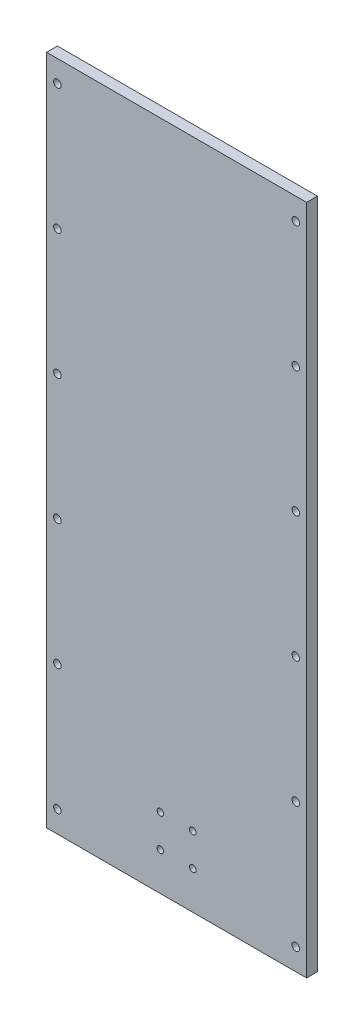
ISO-10303-21;
HEADER;
FILE_DESCRIPTION(('STEP AP214'),'2;1');
FILE_NAME('part.step','',(''),(''),'','','');
FILE_SCHEMA(('AUTOMOTIVE_DESIGN { 1 0 10303 214 1 1 1 1 }'));
ENDSEC;
DATA;
#1=APPLICATION_CONTEXT('core data for automotive mechanical design processes');
#2=APPLICATION_PROTOCOL_DEFINITION('international standard','automotive_design',2000,#1);
#3=PRODUCT_CONTEXT('',#1,'mechanical');
#4=PRODUCT('Part','Part','',(#3));
#5=PRODUCT_RELATED_PRODUCT_CATEGORY('part','',(#4));
#6=PRODUCT_DEFINITION_FORMATION('','',#4);
#7=PRODUCT_DEFINITION_CONTEXT('part definition',#1,'design');
#8=PRODUCT_DEFINITION('design','',#6,#7);
#9=PRODUCT_DEFINITION_SHAPE('','',#8);
#10=(LENGTH_UNIT() NAMED_UNIT(*) SI_UNIT(.MILLI.,.METRE.));
#11=(NAMED_UNIT(*) PLANE_ANGLE_UNIT() SI_UNIT($,.RADIAN.));
#12=(NAMED_UNIT(*) SI_UNIT($,.STERADIAN.) SOLID_ANGLE_UNIT());
#13=UNCERTAINTY_MEASURE_WITH_UNIT(LENGTH_MEASURE(1.E-05),#10,'distance_accuracy_value','');
#14=(GEOMETRIC_REPRESENTATION_CONTEXT(3) GLOBAL_UNCERTAINTY_ASSIGNED_CONTEXT((#13)) GLOBAL_UNIT_ASSIGNED_CONTEXT((#10,
#11,#12)) REPRESENTATION_CONTEXT('',''));
#15=CARTESIAN_POINT('',(0.,0.,0.));
#16=DIRECTION('',(0.,0.,1.));
#17=DIRECTION('',(1.,0.,0.));
#18=AXIS2_PLACEMENT_3D('',#15,#16,#17);
#19=CARTESIAN_POINT('',(-60.,-155.,5.));
#20=DIRECTION('',(1.,0.,0.));
#21=DIRECTION('',(0.,0.,-1.));
#22=AXIS2_PLACEMENT_3D('',#19,#20,#21);
#23=PLANE('',#22);
#24=DIRECTION('',(0.,-1.,0.));
#25=VECTOR('',#24,1.);
#26=CARTESIAN_POINT('',(-60.,-155.,0.));
#27=LINE('',#26,#25);
#28=CARTESIAN_POINT('',(-60.,155.,0.));
#29=VERTEX_POINT('',#28);
#30=CARTESIAN_POINT('',(-60.,-155.,0.));
#31=VERTEX_POINT('',#30);
#32=EDGE_CURVE('E101',#29,#31,#27,.T.);
#33=ORIENTED_EDGE('',*,*,#32,.T.);
#34=DIRECTION('',(0.,0.,-1.));
#35=VECTOR('',#34,1.);
#36=CARTESIAN_POINT('',(-60.,-155.,5.));
#37=LINE('',#36,#35);
#38=CARTESIAN_POINT('',(-60.,-155.,5.));
#39=VERTEX_POINT('',#38);
#40=EDGE_CURVE('E11',#39,#31,#37,.T.);
#41=ORIENTED_EDGE('',*,*,#40,.F.);
#42=DIRECTION('',(0.,-1.,0.));
#43=VECTOR('',#42,1.);
#44=CARTESIAN_POINT('',(-60.,-155.,5.));
#45=LINE('',#44,#43);
#46=CARTESIAN_POINT('',(-60.,155.,5.));
#47=VERTEX_POINT('',#46);
#48=EDGE_CURVE('E88',#47,#39,#45,.T.);
#49=ORIENTED_EDGE('',*,*,#48,.F.);
#50=DIRECTION('',(0.,0.,-1.));
#51=VECTOR('',#50,1.);
#52=CARTESIAN_POINT('',(-60.,155.,5.));
#53=LINE('',#52,#51);
#54=EDGE_CURVE('E97',#47,#29,#53,.T.);
#55=ORIENTED_EDGE('',*,*,#54,.T.);
#56=EDGE_LOOP('',(#33,#41,#49,#55));
#57=FACE_BOUND('',#56,.T.);
#58=ADVANCED_FACE('F35',(#57),#23,.F.);
#59=CARTESIAN_POINT('',(60.,-155.,5.));
#60=DIRECTION('',(0.,1.,0.));
#61=DIRECTION('',(0.,0.,1.));
#62=AXIS2_PLACEMENT_3D('',#59,#60,#61);
#63=PLANE('',#62);
#64=DIRECTION('',(1.,0.,0.));
#65=VECTOR('',#64,1.);
#66=CARTESIAN_POINT('',(60.,-155.,0.));
#67=LINE('',#66,#65);
#68=CARTESIAN_POINT('',(60.,-155.,0.));
#69=VERTEX_POINT('',#68);
#70=EDGE_CURVE('E92',#31,#69,#67,.T.);
#71=ORIENTED_EDGE('',*,*,#70,.T.);
#72=DIRECTION('',(0.,0.,-1.));
#73=VECTOR('',#72,1.);
#74=CARTESIAN_POINT('',(60.,-155.,5.));
#75=LINE('',#74,#73);
#76=CARTESIAN_POINT('',(60.,-155.,5.));
#77=VERTEX_POINT('',#76);
#78=EDGE_CURVE('E44',#77,#69,#75,.T.);
#79=ORIENTED_EDGE('',*,*,#78,.F.);
#80=DIRECTION('',(1.,0.,0.));
#81=VECTOR('',#80,1.);
#82=CARTESIAN_POINT('',(60.,-155.,5.));
#83=LINE('',#82,#81);
#84=EDGE_CURVE('E83',#39,#77,#83,.T.);
#85=ORIENTED_EDGE('',*,*,#84,.F.);
#86=ORIENTED_EDGE('',*,*,#40,.T.);
#87=EDGE_LOOP('',(#71,#79,#85,#86));
#88=FACE_BOUND('',#87,.T.);
#89=ADVANCED_FACE('F91',(#88),#63,.F.);
#90=CARTESIAN_POINT('',(60.,-155.,5.));
#91=DIRECTION('',(-1.,0.,0.));
#92=DIRECTION('',(0.,0.,1.));
#93=AXIS2_PLACEMENT_3D('',#90,#91,#92);
#94=PLANE('',#93);
#95=DIRECTION('',(0.,1.,0.));
#96=VECTOR('',#95,1.);
#97=CARTESIAN_POINT('',(60.,-155.,0.));
#98=LINE('',#97,#96);
#99=CARTESIAN_POINT('',(60.,155.,0.));
#100=VERTEX_POINT('',#99);
#101=EDGE_CURVE('E70',#69,#100,#98,.T.);
#102=ORIENTED_EDGE('',*,*,#101,.T.);
#103=DIRECTION('',(0.,0.,-1.));
#104=VECTOR('',#103,1.);
#105=CARTESIAN_POINT('',(60.,155.,5.));
#106=LINE('',#105,#104);
#107=CARTESIAN_POINT('',(60.,155.,5.));
#108=VERTEX_POINT('',#107);
#109=EDGE_CURVE('E93',#108,#100,#106,.T.);
#110=ORIENTED_EDGE('',*,*,#109,.F.);
#111=DIRECTION('',(0.,1.,0.));
#112=VECTOR('',#111,1.);
#113=CARTESIAN_POINT('',(60.,-155.,5.));
#114=LINE('',#113,#112);
#115=EDGE_CURVE('E86',#77,#108,#114,.T.);
#116=ORIENTED_EDGE('',*,*,#115,.F.);
#117=ORIENTED_EDGE('',*,*,#78,.T.);
#118=EDGE_LOOP('',(#102,#110,#116,#117));
#119=FACE_BOUND('',#118,.T.);
#120=ADVANCED_FACE('F95',(#119),#94,.F.);
#121=CARTESIAN_POINT('',(60.,155.,5.));
#122=DIRECTION('',(0.,-1.,0.));
#123=DIRECTION('',(0.,0.,-1.));
#124=AXIS2_PLACEMENT_3D('',#121,#122,#123);
#125=PLANE('',#124);
#126=DIRECTION('',(-1.,0.,0.));
#127=VECTOR('',#126,1.);
#128=CARTESIAN_POINT('',(60.,155.,0.));
#129=LINE('',#128,#127);
#130=EDGE_CURVE('E76',#100,#29,#129,.T.);
#131=ORIENTED_EDGE('',*,*,#130,.T.);
#132=ORIENTED_EDGE('',*,*,#54,.F.);
#133=DIRECTION('',(-1.,0.,0.));
#134=VECTOR('',#133,1.);
#135=CARTESIAN_POINT('',(60.,155.,5.));
#136=LINE('',#135,#134);
#137=EDGE_CURVE('E53',#108,#47,#136,.T.);
#138=ORIENTED_EDGE('',*,*,#137,.F.);
#139=ORIENTED_EDGE('',*,*,#109,.T.);
#140=EDGE_LOOP('',(#131,#132,#138,#139));
#141=FACE_BOUND('',#140,.T.);
#142=ADVANCED_FACE('F190',(#141),#125,.F.);
#143=CARTESIAN_POINT('',(0.,0.,5.));
#144=DIRECTION('',(0.,0.,1.));
#145=DIRECTION('',(1.,0.,0.));
#146=AXIS2_PLACEMENT_3D('',#143,#144,#145);
#147=PLANE('',#146);
#148=CARTESIAN_POINT('',(55.,87.,5.));
#149=DIRECTION('',(0.,0.,1.));
#150=DIRECTION('',(-1.,0.,0.));
#151=AXIS2_PLACEMENT_3D('',#148,#149,#150);
#152=CIRCLE('',#151,1.74759299465095);
#153=CARTESIAN_POINT('',(53.252407005349,87.,5.));
#154=VERTEX_POINT('',#153);
#155=EDGE_CURVE('E415',#154,#154,#152,.T.);
#156=ORIENTED_EDGE('',*,*,#155,.F.);
#157=EDGE_LOOP('',(#156));
#158=FACE_BOUND('',#157,.T.);
#159=CARTESIAN_POINT('',(55.,-145.,5.));
#160=DIRECTION('',(0.,0.,1.));
#161=DIRECTION('',(-1.,0.,0.));
#162=AXIS2_PLACEMENT_3D('',#159,#160,#161);
#163=CIRCLE('',#162,1.74759299465095);
#164=CARTESIAN_POINT('',(53.252407005349,-145.,5.));
#165=VERTEX_POINT('',#164);
#166=EDGE_CURVE('E409',#165,#165,#163,.T.);
#167=ORIENTED_EDGE('',*,*,#166,.F.);
#168=EDGE_LOOP('',(#167));
#169=FACE_BOUND('',#168,.T.);
#170=CARTESIAN_POINT('',(-55.,-87.,5.));
#171=DIRECTION('',(0.,0.,1.));
#172=DIRECTION('',(1.,0.,0.));
#173=AXIS2_PLACEMENT_3D('',#170,#171,#172);
#174=CIRCLE('',#173,1.74759299465095);
#175=CARTESIAN_POINT('',(-53.252407005349,-87.,5.));
#176=VERTEX_POINT('',#175);
#177=EDGE_CURVE('E365',#176,#176,#174,.T.);
#178=ORIENTED_EDGE('',*,*,#177,.F.);
#179=EDGE_LOOP('',(#178));
#180=FACE_BOUND('',#179,.T.);
#181=CARTESIAN_POINT('',(-55.,-29.,5.));
#182=DIRECTION('',(0.,0.,1.));
#183=DIRECTION('',(1.,0.,0.));
#184=AXIS2_PLACEMENT_3D('',#181,#182,#183);
#185=CIRCLE('',#184,1.74759299465095);
#186=CARTESIAN_POINT('',(-53.252407005349,-29.,5.));
#187=VERTEX_POINT('',#186);
#188=EDGE_CURVE('E408',#187,#187,#185,.T.);
#189=ORIENTED_EDGE('',*,*,#188,.F.);
#190=EDGE_LOOP('',(#189));
#191=FACE_BOUND('',#190,.T.);
#192=CARTESIAN_POINT('',(-55.,-145.,5.));
#193=DIRECTION('',(0.,0.,1.));
#194=DIRECTION('',(1.,0.,0.));
#195=AXIS2_PLACEMENT_3D('',#192,#193,#194);
#196=CIRCLE('',#195,1.74759299465095);
#197=CARTESIAN_POINT('',(-53.252407005349,-145.,5.));
#198=VERTEX_POINT('',#197);
#199=EDGE_CURVE('E427',#198,#198,#196,.T.);
#200=ORIENTED_EDGE('',*,*,#199,.F.);
#201=EDGE_LOOP('',(#200));
#202=FACE_BOUND('',#201,.T.);
#203=CARTESIAN_POINT('',(55.,145.,5.));
#204=DIRECTION('',(0.,0.,1.));
#205=DIRECTION('',(1.,0.,0.));
#206=AXIS2_PLACEMENT_3D('',#203,#204,#205);
#207=CIRCLE('',#206,1.74759299465095);
#208=CARTESIAN_POINT('',(56.747592994651,145.,5.));
#209=VERTEX_POINT('',#208);
#210=EDGE_CURVE('E424',#209,#209,#207,.T.);
#211=ORIENTED_EDGE('',*,*,#210,.F.);
#212=EDGE_LOOP('',(#211));
#213=FACE_BOUND('',#212,.T.);
#214=CARTESIAN_POINT('',(-55.,87.,5.));
#215=DIRECTION('',(0.,0.,1.));
#216=DIRECTION('',(1.,0.,0.));
#217=AXIS2_PLACEMENT_3D('',#214,#215,#216);
#218=CIRCLE('',#217,1.74759299465095);
#219=CARTESIAN_POINT('',(-53.252407005349,87.,5.));
#220=VERTEX_POINT('',#219);
#221=EDGE_CURVE('E421',#220,#220,#218,.T.);
#222=ORIENTED_EDGE('',*,*,#221,.F.);
#223=EDGE_LOOP('',(#222));
#224=FACE_BOUND('',#223,.T.);
#225=CARTESIAN_POINT('',(-55.,29.,5.));
#226=DIRECTION('',(0.,0.,1.));
#227=DIRECTION('',(1.,0.,0.));
#228=AXIS2_PLACEMENT_3D('',#225,#226,#227);
#229=CIRCLE('',#228,1.74759299465095);
#230=CARTESIAN_POINT('',(-53.252407005349,29.,5.));
#231=VERTEX_POINT('',#230);
#232=EDGE_CURVE('E412',#231,#231,#229,.T.);
#233=ORIENTED_EDGE('',*,*,#232,.F.);
#234=EDGE_LOOP('',(#233));
#235=FACE_BOUND('',#234,.T.);
#236=CARTESIAN_POINT('',(-7.5,-137.5,5.));
#237=DIRECTION('',(0.,0.,1.));
#238=DIRECTION('',(1.,0.,0.));
#239=AXIS2_PLACEMENT_3D('',#236,#237,#238);
#240=CIRCLE('',#239,1.5);
#241=CARTESIAN_POINT('',(-6.,-137.5,5.));
#242=VERTEX_POINT('',#241);
#243=EDGE_CURVE('E445',#242,#242,#240,.T.);
#244=ORIENTED_EDGE('',*,*,#243,.F.);
#245=EDGE_LOOP('',(#244));
#246=FACE_BOUND('',#245,.T.);
#247=CARTESIAN_POINT('',(7.5,-137.5,5.));
#248=DIRECTION('',(0.,0.,1.));
#249=DIRECTION('',(1.,0.,0.));
#250=AXIS2_PLACEMENT_3D('',#247,#248,#249);
#251=CIRCLE('',#250,1.5);
#252=CARTESIAN_POINT('',(9.,-137.5,5.));
#253=VERTEX_POINT('',#252);
#254=EDGE_CURVE('E449',#253,#253,#251,.T.);
#255=ORIENTED_EDGE('',*,*,#254,.F.);
#256=EDGE_LOOP('',(#255));
#257=FACE_BOUND('',#256,.T.);
#258=CARTESIAN_POINT('',(7.5,-122.5,5.));
#259=DIRECTION('',(0.,0.,1.));
#260=DIRECTION('',(1.,0.,0.));
#261=AXIS2_PLACEMENT_3D('',#258,#259,#260);
#262=CIRCLE('',#261,1.5);
#263=CARTESIAN_POINT('',(9.,-122.5,5.));
#264=VERTEX_POINT('',#263);
#265=EDGE_CURVE('E453',#264,#264,#262,.T.);
#266=ORIENTED_EDGE('',*,*,#265,.F.);
#267=EDGE_LOOP('',(#266));
#268=FACE_BOUND('',#267,.T.);
#269=CARTESIAN_POINT('',(-7.5,-122.5,5.));
#270=DIRECTION('',(0.,0.,1.));
#271=DIRECTION('',(1.,0.,0.));
#272=AXIS2_PLACEMENT_3D('',#269,#270,#271);
#273=CIRCLE('',#272,1.5);
#274=CARTESIAN_POINT('',(-6.,-122.5,5.));
#275=VERTEX_POINT('',#274);
#276=EDGE_CURVE('E457',#275,#275,#273,.T.);
#277=ORIENTED_EDGE('',*,*,#276,.F.);
#278=EDGE_LOOP('',(#277));
#279=FACE_BOUND('',#278,.T.);
#280=CARTESIAN_POINT('',(55.,-87.,5.));
#281=DIRECTION('',(0.,0.,1.));
#282=DIRECTION('',(-1.,0.,0.));
#283=AXIS2_PLACEMENT_3D('',#280,#281,#282);
#284=CIRCLE('',#283,1.74759299465095);
#285=CARTESIAN_POINT('',(53.252407005349,-87.,5.));
#286=VERTEX_POINT('',#285);
#287=EDGE_CURVE('E461',#286,#286,#284,.T.);
#288=ORIENTED_EDGE('',*,*,#287,.F.);
#289=EDGE_LOOP('',(#288));
#290=FACE_BOUND('',#289,.T.);
#291=CARTESIAN_POINT('',(55.,-29.,5.));
#292=DIRECTION('',(0.,0.,1.));
#293=DIRECTION('',(-1.,0.,0.));
#294=AXIS2_PLACEMENT_3D('',#291,#292,#293);
#295=CIRCLE('',#294,1.74759299465095);
#296=CARTESIAN_POINT('',(53.252407005349,-29.,5.));
#297=VERTEX_POINT('',#296);
#298=EDGE_CURVE('E465',#297,#297,#295,.T.);
#299=ORIENTED_EDGE('',*,*,#298,.F.);
#300=EDGE_LOOP('',(#299));
#301=FACE_BOUND('',#300,.T.);
#302=CARTESIAN_POINT('',(55.,29.,5.));
#303=DIRECTION('',(0.,0.,1.));
#304=DIRECTION('',(-1.,0.,0.));
#305=AXIS2_PLACEMENT_3D('',#302,#303,#304);
#306=CIRCLE('',#305,1.74759299465095);
#307=CARTESIAN_POINT('',(53.252407005349,29.,5.));
#308=VERTEX_POINT('',#307);
#309=EDGE_CURVE('E420',#308,#308,#306,.T.);
#310=ORIENTED_EDGE('',*,*,#309,.F.);
#311=EDGE_LOOP('',(#310));
#312=FACE_BOUND('',#311,.T.);
#313=CARTESIAN_POINT('',(-55.,145.,5.));
#314=DIRECTION('',(0.,0.,1.));
#315=DIRECTION('',(1.,0.,0.));
#316=AXIS2_PLACEMENT_3D('',#313,#314,#315);
#317=CIRCLE('',#316,1.74759299465095);
#318=CARTESIAN_POINT('',(-53.252407005349,145.,5.));
#319=VERTEX_POINT('',#318);
#320=EDGE_CURVE('E113',#319,#319,#317,.T.);
#321=ORIENTED_EDGE('',*,*,#320,.F.);
#322=EDGE_LOOP('',(#321));
#323=FACE_BOUND('',#322,.T.);
#324=ORIENTED_EDGE('',*,*,#48,.T.);
#325=ORIENTED_EDGE('',*,*,#84,.T.);
#326=ORIENTED_EDGE('',*,*,#115,.T.);
#327=ORIENTED_EDGE('',*,*,#137,.T.);
#328=EDGE_LOOP('',(#324,#325,#326,#327));
#329=FACE_BOUND('',#328,.T.);
#330=ADVANCED_FACE('F84',(#158,#169,#180,#191,#202,#213,#224,#235,#246,#257,#268,#279,#290,#301,
#312,#323,#329),#147,.T.);
#331=CARTESIAN_POINT('',(0.,0.,0.));
#332=DIRECTION('',(0.,0.,1.));
#333=DIRECTION('',(1.,0.,0.));
#334=AXIS2_PLACEMENT_3D('',#331,#332,#333);
#335=PLANE('',#334);
#336=CARTESIAN_POINT('',(55.,87.,0.));
#337=DIRECTION('',(0.,0.,1.));
#338=DIRECTION('',(1.,0.,0.));
#339=AXIS2_PLACEMENT_3D('',#336,#337,#338);
#340=CIRCLE('',#339,1.74759299465095);
#341=CARTESIAN_POINT('',(56.7475929946509,87.,0.));
#342=VERTEX_POINT('',#341);
#343=EDGE_CURVE('E38',#342,#342,#340,.T.);
#344=ORIENTED_EDGE('',*,*,#343,.T.);
#345=EDGE_LOOP('',(#344));
#346=FACE_BOUND('',#345,.T.);
#347=CARTESIAN_POINT('',(55.,-145.,0.));
#348=DIRECTION('',(0.,0.,1.));
#349=DIRECTION('',(1.,0.,0.));
#350=AXIS2_PLACEMENT_3D('',#347,#348,#349);
#351=CIRCLE('',#350,1.74759299465095);
#352=CARTESIAN_POINT('',(56.747592994651,-145.,0.));
#353=VERTEX_POINT('',#352);
#354=EDGE_CURVE('E151',#353,#353,#351,.T.);
#355=ORIENTED_EDGE('',*,*,#354,.T.);
#356=EDGE_LOOP('',(#355));
#357=FACE_BOUND('',#356,.T.);
#358=CARTESIAN_POINT('',(-55.,-87.,0.));
#359=DIRECTION('',(0.,0.,1.));
#360=DIRECTION('',(1.,0.,0.));
#361=AXIS2_PLACEMENT_3D('',#358,#359,#360);
#362=CIRCLE('',#361,1.74759299465095);
#363=CARTESIAN_POINT('',(-53.252407005349,-87.,0.));
#364=VERTEX_POINT('',#363);
#365=EDGE_CURVE('E149',#364,#364,#362,.T.);
#366=ORIENTED_EDGE('',*,*,#365,.T.);
#367=EDGE_LOOP('',(#366));
#368=FACE_BOUND('',#367,.T.);
#369=CARTESIAN_POINT('',(-55.,-29.,0.));
#370=DIRECTION('',(0.,0.,1.));
#371=DIRECTION('',(1.,0.,0.));
#372=AXIS2_PLACEMENT_3D('',#369,#370,#371);
#373=CIRCLE('',#372,1.74759299465095);
#374=CARTESIAN_POINT('',(-53.252407005349,-29.,0.));
#375=VERTEX_POINT('',#374);
#376=EDGE_CURVE('E146',#375,#375,#373,.T.);
#377=ORIENTED_EDGE('',*,*,#376,.T.);
#378=EDGE_LOOP('',(#377));
#379=FACE_BOUND('',#378,.T.);
#380=CARTESIAN_POINT('',(-55.,-145.,0.));
#381=DIRECTION('',(0.,0.,1.));
#382=DIRECTION('',(1.,0.,0.));
#383=AXIS2_PLACEMENT_3D('',#380,#381,#382);
#384=CIRCLE('',#383,1.74759299465095);
#385=CARTESIAN_POINT('',(-53.252407005349,-145.,0.));
#386=VERTEX_POINT('',#385);
#387=EDGE_CURVE('E143',#386,#386,#384,.T.);
#388=ORIENTED_EDGE('',*,*,#387,.T.);
#389=EDGE_LOOP('',(#388));
#390=FACE_BOUND('',#389,.T.);
#391=CARTESIAN_POINT('',(55.,145.,0.));
#392=DIRECTION('',(0.,0.,1.));
#393=DIRECTION('',(1.,0.,0.));
#394=AXIS2_PLACEMENT_3D('',#391,#392,#393);
#395=CIRCLE('',#394,1.74759299465095);
#396=CARTESIAN_POINT('',(56.747592994651,145.,0.));
#397=VERTEX_POINT('',#396);
#398=EDGE_CURVE('E140',#397,#397,#395,.T.);
#399=ORIENTED_EDGE('',*,*,#398,.T.);
#400=EDGE_LOOP('',(#399));
#401=FACE_BOUND('',#400,.T.);
#402=CARTESIAN_POINT('',(-55.,87.,0.));
#403=DIRECTION('',(0.,0.,1.));
#404=DIRECTION('',(1.,0.,0.));
#405=AXIS2_PLACEMENT_3D('',#402,#403,#404);
#406=CIRCLE('',#405,1.74759299465095);
#407=CARTESIAN_POINT('',(-53.252407005349,87.,0.));
#408=VERTEX_POINT('',#407);
#409=EDGE_CURVE('E137',#408,#408,#406,.T.);
#410=ORIENTED_EDGE('',*,*,#409,.T.);
#411=EDGE_LOOP('',(#410));
#412=FACE_BOUND('',#411,.T.);
#413=CARTESIAN_POINT('',(-55.,29.,0.));
#414=DIRECTION('',(0.,0.,1.));
#415=DIRECTION('',(1.,0.,0.));
#416=AXIS2_PLACEMENT_3D('',#413,#414,#415);
#417=CIRCLE('',#416,1.74759299465095);
#418=CARTESIAN_POINT('',(-53.252407005349,29.,0.));
#419=VERTEX_POINT('',#418);
#420=EDGE_CURVE('E134',#419,#419,#417,.T.);
#421=ORIENTED_EDGE('',*,*,#420,.T.);
#422=EDGE_LOOP('',(#421));
#423=FACE_BOUND('',#422,.T.);
#424=CARTESIAN_POINT('',(-7.5,-137.5,0.));
#425=DIRECTION('',(0.,0.,1.));
#426=DIRECTION('',(1.,0.,0.));
#427=AXIS2_PLACEMENT_3D('',#424,#425,#426);
#428=CIRCLE('',#427,1.5);
#429=CARTESIAN_POINT('',(-6.,-137.5,0.));
#430=VERTEX_POINT('',#429);
#431=EDGE_CURVE('E131',#430,#430,#428,.T.);
#432=ORIENTED_EDGE('',*,*,#431,.T.);
#433=EDGE_LOOP('',(#432));
#434=FACE_BOUND('',#433,.T.);
#435=CARTESIAN_POINT('',(7.5,-137.5,0.));
#436=DIRECTION('',(0.,0.,1.));
#437=DIRECTION('',(1.,0.,0.));
#438=AXIS2_PLACEMENT_3D('',#435,#436,#437);
#439=CIRCLE('',#438,1.5);
#440=CARTESIAN_POINT('',(9.,-137.5,0.));
#441=VERTEX_POINT('',#440);
#442=EDGE_CURVE('E128',#441,#441,#439,.T.);
#443=ORIENTED_EDGE('',*,*,#442,.T.);
#444=EDGE_LOOP('',(#443));
#445=FACE_BOUND('',#444,.T.);
#446=CARTESIAN_POINT('',(7.5,-122.5,0.));
#447=DIRECTION('',(0.,0.,1.));
#448=DIRECTION('',(1.,0.,0.));
#449=AXIS2_PLACEMENT_3D('',#446,#447,#448);
#450=CIRCLE('',#449,1.5);
#451=CARTESIAN_POINT('',(9.,-122.5,0.));
#452=VERTEX_POINT('',#451);
#453=EDGE_CURVE('E125',#452,#452,#450,.T.);
#454=ORIENTED_EDGE('',*,*,#453,.T.);
#455=EDGE_LOOP('',(#454));
#456=FACE_BOUND('',#455,.T.);
#457=CARTESIAN_POINT('',(-7.5,-122.5,0.));
#458=DIRECTION('',(0.,0.,1.));
#459=DIRECTION('',(1.,0.,0.));
#460=AXIS2_PLACEMENT_3D('',#457,#458,#459);
#461=CIRCLE('',#460,1.5);
#462=CARTESIAN_POINT('',(-6.,-122.5,0.));
#463=VERTEX_POINT('',#462);
#464=EDGE_CURVE('E122',#463,#463,#461,.T.);
#465=ORIENTED_EDGE('',*,*,#464,.T.);
#466=EDGE_LOOP('',(#465));
#467=FACE_BOUND('',#466,.T.);
#468=CARTESIAN_POINT('',(55.,-87.,0.));
#469=DIRECTION('',(0.,0.,1.));
#470=DIRECTION('',(1.,0.,0.));
#471=AXIS2_PLACEMENT_3D('',#468,#469,#470);
#472=CIRCLE('',#471,1.74759299465095);
#473=CARTESIAN_POINT('',(56.7475929946509,-87.,0.));
#474=VERTEX_POINT('',#473);
#475=EDGE_CURVE('E119',#474,#474,#472,.T.);
#476=ORIENTED_EDGE('',*,*,#475,.T.);
#477=EDGE_LOOP('',(#476));
#478=FACE_BOUND('',#477,.T.);
#479=CARTESIAN_POINT('',(55.,-29.,0.));
#480=DIRECTION('',(0.,0.,1.));
#481=DIRECTION('',(1.,0.,0.));
#482=AXIS2_PLACEMENT_3D('',#479,#480,#481);
#483=CIRCLE('',#482,1.74759299465095);
#484=CARTESIAN_POINT('',(56.7475929946509,-29.,0.));
#485=VERTEX_POINT('',#484);
#486=EDGE_CURVE('E116',#485,#485,#483,.T.);
#487=ORIENTED_EDGE('',*,*,#486,.T.);
#488=EDGE_LOOP('',(#487));
#489=FACE_BOUND('',#488,.T.);
#490=CARTESIAN_POINT('',(55.,29.,0.));
#491=DIRECTION('',(0.,0.,1.));
#492=DIRECTION('',(1.,0.,0.));
#493=AXIS2_PLACEMENT_3D('',#490,#491,#492);
#494=CIRCLE('',#493,1.74759299465095);
#495=CARTESIAN_POINT('',(56.7475929946509,29.,0.));
#496=VERTEX_POINT('',#495);
#497=EDGE_CURVE('E112',#496,#496,#494,.T.);
#498=ORIENTED_EDGE('',*,*,#497,.T.);
#499=EDGE_LOOP('',(#498));
#500=FACE_BOUND('',#499,.T.);
#501=CARTESIAN_POINT('',(-55.,145.,0.));
#502=DIRECTION('',(0.,0.,1.));
#503=DIRECTION('',(1.,0.,0.));
#504=AXIS2_PLACEMENT_3D('',#501,#502,#503);
#505=CIRCLE('',#504,1.74759299465095);
#506=CARTESIAN_POINT('',(-53.252407005349,145.,0.));
#507=VERTEX_POINT('',#506);
#508=EDGE_CURVE('E109',#507,#507,#505,.T.);
#509=ORIENTED_EDGE('',*,*,#508,.T.);
#510=EDGE_LOOP('',(#509));
#511=FACE_BOUND('',#510,.T.);
#512=ORIENTED_EDGE('',*,*,#32,.F.);
#513=ORIENTED_EDGE('',*,*,#130,.F.);
#514=ORIENTED_EDGE('',*,*,#101,.F.);
#515=ORIENTED_EDGE('',*,*,#70,.F.);
#516=EDGE_LOOP('',(#512,#513,#514,#515));
#517=FACE_BOUND('',#516,.T.);
#518=ADVANCED_FACE('F158',(#346,#357,#368,#379,#390,#401,#412,#423,#434,#445,#456,#467,#478,
#489,#500,#511,#517),#335,.F.);
#519=CARTESIAN_POINT('',(-55.,145.,-5.));
#520=DIRECTION('',(0.,0.,1.));
#521=DIRECTION('',(1.,0.,0.));
#522=AXIS2_PLACEMENT_3D('',#519,#520,#521);
#523=CYLINDRICAL_SURFACE('',#522,1.74759299465095);
#524=ORIENTED_EDGE('',*,*,#320,.T.);
#525=EDGE_LOOP('',(#524));
#526=FACE_BOUND('',#525,.T.);
#527=ORIENTED_EDGE('',*,*,#508,.F.);
#528=EDGE_LOOP('',(#527));
#529=FACE_BOUND('',#528,.T.);
#530=ADVANCED_FACE('F181',(#526,#529),#523,.F.);
#531=CARTESIAN_POINT('',(55.,29.,-5.));
#532=DIRECTION('',(0.,0.,1.));
#533=DIRECTION('',(1.,0.,0.));
#534=AXIS2_PLACEMENT_3D('',#531,#532,#533);
#535=CYLINDRICAL_SURFACE('',#534,1.74759299465095);
#536=ORIENTED_EDGE('',*,*,#309,.T.);
#537=EDGE_LOOP('',(#536));
#538=FACE_BOUND('',#537,.T.);
#539=ORIENTED_EDGE('',*,*,#497,.F.);
#540=EDGE_LOOP('',(#539));
#541=FACE_BOUND('',#540,.T.);
#542=ADVANCED_FACE('F187',(#538,#541),#535,.F.);
#543=CARTESIAN_POINT('',(55.,-29.,-5.));
#544=DIRECTION('',(0.,0.,1.));
#545=DIRECTION('',(1.,0.,0.));
#546=AXIS2_PLACEMENT_3D('',#543,#544,#545);
#547=CYLINDRICAL_SURFACE('',#546,1.74759299465095);
#548=ORIENTED_EDGE('',*,*,#298,.T.);
#549=EDGE_LOOP('',(#548));
#550=FACE_BOUND('',#549,.T.);
#551=ORIENTED_EDGE('',*,*,#486,.F.);
#552=EDGE_LOOP('',(#551));
#553=FACE_BOUND('',#552,.T.);
#554=ADVANCED_FACE('F230',(#550,#553),#547,.F.);
#555=CARTESIAN_POINT('',(55.,-87.,-5.));
#556=DIRECTION('',(0.,0.,1.));
#557=DIRECTION('',(1.,0.,0.));
#558=AXIS2_PLACEMENT_3D('',#555,#556,#557);
#559=CYLINDRICAL_SURFACE('',#558,1.74759299465095);
#560=ORIENTED_EDGE('',*,*,#287,.T.);
#561=EDGE_LOOP('',(#560));
#562=FACE_BOUND('',#561,.T.);
#563=ORIENTED_EDGE('',*,*,#475,.F.);
#564=EDGE_LOOP('',(#563));
#565=FACE_BOUND('',#564,.T.);
#566=ADVANCED_FACE('F240',(#562,#565),#559,.F.);
#567=CARTESIAN_POINT('',(-7.5,-122.5,-5.));
#568=DIRECTION('',(0.,0.,1.));
#569=DIRECTION('',(1.,0.,0.));
#570=AXIS2_PLACEMENT_3D('',#567,#568,#569);
#571=CYLINDRICAL_SURFACE('',#570,1.5);
#572=ORIENTED_EDGE('',*,*,#276,.T.);
#573=EDGE_LOOP('',(#572));
#574=FACE_BOUND('',#573,.T.);
#575=ORIENTED_EDGE('',*,*,#464,.F.);
#576=EDGE_LOOP('',(#575));
#577=FACE_BOUND('',#576,.T.);
#578=ADVANCED_FACE('F250',(#574,#577),#571,.F.);
#579=CARTESIAN_POINT('',(7.5,-122.5,-5.));
#580=DIRECTION('',(0.,0.,1.));
#581=DIRECTION('',(1.,0.,0.));
#582=AXIS2_PLACEMENT_3D('',#579,#580,#581);
#583=CYLINDRICAL_SURFACE('',#582,1.5);
#584=ORIENTED_EDGE('',*,*,#265,.T.);
#585=EDGE_LOOP('',(#584));
#586=FACE_BOUND('',#585,.T.);
#587=ORIENTED_EDGE('',*,*,#453,.F.);
#588=EDGE_LOOP('',(#587));
#589=FACE_BOUND('',#588,.T.);
#590=ADVANCED_FACE('F260',(#586,#589),#583,.F.);
#591=CARTESIAN_POINT('',(7.5,-137.5,-5.));
#592=DIRECTION('',(0.,0.,1.));
#593=DIRECTION('',(1.,0.,0.));
#594=AXIS2_PLACEMENT_3D('',#591,#592,#593);
#595=CYLINDRICAL_SURFACE('',#594,1.5);
#596=ORIENTED_EDGE('',*,*,#254,.T.);
#597=EDGE_LOOP('',(#596));
#598=FACE_BOUND('',#597,.T.);
#599=ORIENTED_EDGE('',*,*,#442,.F.);
#600=EDGE_LOOP('',(#599));
#601=FACE_BOUND('',#600,.T.);
#602=ADVANCED_FACE('F270',(#598,#601),#595,.F.);
#603=CARTESIAN_POINT('',(-7.5,-137.5,-5.));
#604=DIRECTION('',(0.,0.,1.));
#605=DIRECTION('',(1.,0.,0.));
#606=AXIS2_PLACEMENT_3D('',#603,#604,#605);
#607=CYLINDRICAL_SURFACE('',#606,1.5);
#608=ORIENTED_EDGE('',*,*,#243,.T.);
#609=EDGE_LOOP('',(#608));
#610=FACE_BOUND('',#609,.T.);
#611=ORIENTED_EDGE('',*,*,#431,.F.);
#612=EDGE_LOOP('',(#611));
#613=FACE_BOUND('',#612,.T.);
#614=ADVANCED_FACE('F280',(#610,#613),#607,.F.);
#615=CARTESIAN_POINT('',(-55.,29.,-5.));
#616=DIRECTION('',(0.,0.,1.));
#617=DIRECTION('',(1.,0.,0.));
#618=AXIS2_PLACEMENT_3D('',#615,#616,#617);
#619=CYLINDRICAL_SURFACE('',#618,1.74759299465095);
#620=ORIENTED_EDGE('',*,*,#232,.T.);
#621=EDGE_LOOP('',(#620));
#622=FACE_BOUND('',#621,.T.);
#623=ORIENTED_EDGE('',*,*,#420,.F.);
#624=EDGE_LOOP('',(#623));
#625=FACE_BOUND('',#624,.T.);
#626=ADVANCED_FACE('F290',(#622,#625),#619,.F.);
#627=CARTESIAN_POINT('',(-55.,87.,-5.));
#628=DIRECTION('',(0.,0.,1.));
#629=DIRECTION('',(1.,0.,0.));
#630=AXIS2_PLACEMENT_3D('',#627,#628,#629);
#631=CYLINDRICAL_SURFACE('',#630,1.74759299465095);
#632=ORIENTED_EDGE('',*,*,#221,.T.);
#633=EDGE_LOOP('',(#632));
#634=FACE_BOUND('',#633,.T.);
#635=ORIENTED_EDGE('',*,*,#409,.F.);
#636=EDGE_LOOP('',(#635));
#637=FACE_BOUND('',#636,.T.);
#638=ADVANCED_FACE('F300',(#634,#637),#631,.F.);
#639=CARTESIAN_POINT('',(55.,145.,-5.));
#640=DIRECTION('',(0.,0.,1.));
#641=DIRECTION('',(1.,0.,0.));
#642=AXIS2_PLACEMENT_3D('',#639,#640,#641);
#643=CYLINDRICAL_SURFACE('',#642,1.74759299465095);
#644=ORIENTED_EDGE('',*,*,#210,.T.);
#645=EDGE_LOOP('',(#644));
#646=FACE_BOUND('',#645,.T.);
#647=ORIENTED_EDGE('',*,*,#398,.F.);
#648=EDGE_LOOP('',(#647));
#649=FACE_BOUND('',#648,.T.);
#650=ADVANCED_FACE('F310',(#646,#649),#643,.F.);
#651=CARTESIAN_POINT('',(-55.,-145.,-5.));
#652=DIRECTION('',(0.,0.,1.));
#653=DIRECTION('',(1.,0.,0.));
#654=AXIS2_PLACEMENT_3D('',#651,#652,#653);
#655=CYLINDRICAL_SURFACE('',#654,1.74759299465095);
#656=ORIENTED_EDGE('',*,*,#199,.T.);
#657=EDGE_LOOP('',(#656));
#658=FACE_BOUND('',#657,.T.);
#659=ORIENTED_EDGE('',*,*,#387,.F.);
#660=EDGE_LOOP('',(#659));
#661=FACE_BOUND('',#660,.T.);
#662=ADVANCED_FACE('F319',(#658,#661),#655,.F.);
#663=CARTESIAN_POINT('',(-55.,-29.,-5.));
#664=DIRECTION('',(0.,0.,1.));
#665=DIRECTION('',(1.,0.,0.));
#666=AXIS2_PLACEMENT_3D('',#663,#664,#665);
#667=CYLINDRICAL_SURFACE('',#666,1.74759299465095);
#668=ORIENTED_EDGE('',*,*,#188,.T.);
#669=EDGE_LOOP('',(#668));
#670=FACE_BOUND('',#669,.T.);
#671=ORIENTED_EDGE('',*,*,#376,.F.);
#672=EDGE_LOOP('',(#671));
#673=FACE_BOUND('',#672,.T.);
#674=ADVANCED_FACE('F329',(#670,#673),#667,.F.);
#675=CARTESIAN_POINT('',(-55.,-87.,-5.));
#676=DIRECTION('',(0.,0.,1.));
#677=DIRECTION('',(1.,0.,0.));
#678=AXIS2_PLACEMENT_3D('',#675,#676,#677);
#679=CYLINDRICAL_SURFACE('',#678,1.74759299465095);
#680=ORIENTED_EDGE('',*,*,#177,.T.);
#681=EDGE_LOOP('',(#680));
#682=FACE_BOUND('',#681,.T.);
#683=ORIENTED_EDGE('',*,*,#365,.F.);
#684=EDGE_LOOP('',(#683));
#685=FACE_BOUND('',#684,.T.);
#686=ADVANCED_FACE('F168',(#682,#685),#679,.F.);
#687=CARTESIAN_POINT('',(55.,-145.,-5.));
#688=DIRECTION('',(0.,0.,1.));
#689=DIRECTION('',(1.,0.,0.));
#690=AXIS2_PLACEMENT_3D('',#687,#688,#689);
#691=CYLINDRICAL_SURFACE('',#690,1.74759299465095);
#692=ORIENTED_EDGE('',*,*,#166,.T.);
#693=EDGE_LOOP('',(#692));
#694=FACE_BOUND('',#693,.T.);
#695=ORIENTED_EDGE('',*,*,#354,.F.);
#696=EDGE_LOOP('',(#695));
#697=FACE_BOUND('',#696,.T.);
#698=ADVANCED_FACE('F162',(#694,#697),#691,.F.);
#699=CARTESIAN_POINT('',(55.,87.,-5.));
#700=DIRECTION('',(0.,0.,1.));
#701=DIRECTION('',(1.,0.,0.));
#702=AXIS2_PLACEMENT_3D('',#699,#700,#701);
#703=CYLINDRICAL_SURFACE('',#702,1.74759299465095);
#704=ORIENTED_EDGE('',*,*,#155,.T.);
#705=EDGE_LOOP('',(#704));
#706=FACE_BOUND('',#705,.T.);
#707=ORIENTED_EDGE('',*,*,#343,.F.);
#708=EDGE_LOOP('',(#707));
#709=FACE_BOUND('',#708,.T.);
#710=ADVANCED_FACE('F160',(#706,#709),#703,.F.);
#711=CLOSED_SHELL('',(#58,#89,#120,#142,#330,#518,#530,#542,#554,#566,#578,#590,#602,#614,#626,
#638,#650,#662,#674,#686,#698,#710));
#712=MANIFOLD_SOLID_BREP('B2',#711);
#713=ADVANCED_BREP_SHAPE_REPRESENTATION('',(#18,#712),#14);
#714=SHAPE_DEFINITION_REPRESENTATION(#9,#713);
ENDSEC;
END-ISO-10303-21;
